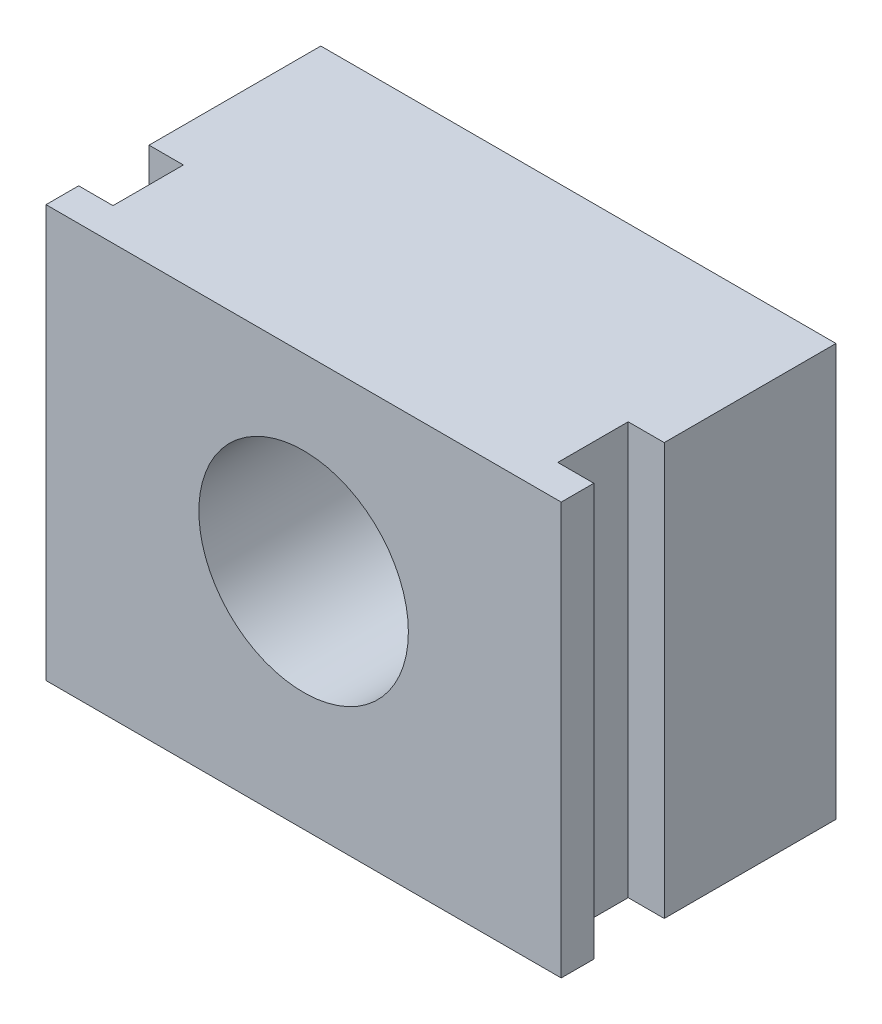
ISO-10303-21;
HEADER;
FILE_DESCRIPTION(('STEP AP214'),'2;1');
FILE_NAME('part.step','',(''),(''),'','','');
FILE_SCHEMA(('AUTOMOTIVE_DESIGN { 1 0 10303 214 1 1 1 1 }'));
ENDSEC;
DATA;
#1=APPLICATION_CONTEXT('core data for automotive mechanical design processes');
#2=APPLICATION_PROTOCOL_DEFINITION('international standard','automotive_design',2000,#1);
#3=PRODUCT_CONTEXT('',#1,'mechanical');
#4=PRODUCT('Part','Part','',(#3));
#5=PRODUCT_RELATED_PRODUCT_CATEGORY('part','',(#4));
#6=PRODUCT_DEFINITION_FORMATION('','',#4);
#7=PRODUCT_DEFINITION_CONTEXT('part definition',#1,'design');
#8=PRODUCT_DEFINITION('design','',#6,#7);
#9=PRODUCT_DEFINITION_SHAPE('','',#8);
#10=(LENGTH_UNIT() NAMED_UNIT(*) SI_UNIT(.MILLI.,.METRE.));
#11=(NAMED_UNIT(*) PLANE_ANGLE_UNIT() SI_UNIT($,.RADIAN.));
#12=(NAMED_UNIT(*) SI_UNIT($,.STERADIAN.) SOLID_ANGLE_UNIT());
#13=UNCERTAINTY_MEASURE_WITH_UNIT(LENGTH_MEASURE(1.E-05),#10,'distance_accuracy_value','');
#14=(GEOMETRIC_REPRESENTATION_CONTEXT(3) GLOBAL_UNCERTAINTY_ASSIGNED_CONTEXT((#13)) GLOBAL_UNIT_ASSIGNED_CONTEXT((#10,
#11,#12)) REPRESENTATION_CONTEXT('',''));
#15=CARTESIAN_POINT('',(0.,0.,0.));
#16=DIRECTION('',(0.,0.,1.));
#17=DIRECTION('',(1.,0.,0.));
#18=AXIS2_PLACEMENT_3D('',#15,#16,#17);
#19=CARTESIAN_POINT('',(0.,0.,5.));
#20=DIRECTION('',(0.,0.,1.));
#21=DIRECTION('',(1.,0.,0.));
#22=AXIS2_PLACEMENT_3D('',#19,#20,#21);
#23=PLANE('',#22);
#24=DIRECTION('',(-1.,0.,0.));
#25=VECTOR('',#24,1.);
#26=CARTESIAN_POINT('',(-7.5,6.,5.));
#27=LINE('',#26,#25);
#28=CARTESIAN_POINT('',(7.5,6.,5.));
#29=VERTEX_POINT('',#28);
#30=CARTESIAN_POINT('',(6.45,6.,5.));
#31=VERTEX_POINT('',#30);
#32=EDGE_CURVE('E233',#29,#31,#27,.T.);
#33=ORIENTED_EDGE('',*,*,#32,.T.);
#34=DIRECTION('',(0.,-1.,0.));
#35=VECTOR('',#34,1.);
#36=CARTESIAN_POINT('',(6.45,6.,5.));
#37=LINE('',#36,#35);
#38=CARTESIAN_POINT('',(6.45,-6.,5.));
#39=VERTEX_POINT('',#38);
#40=EDGE_CURVE('E164',#31,#39,#37,.T.);
#41=ORIENTED_EDGE('',*,*,#40,.T.);
#42=DIRECTION('',(1.,0.,0.));
#43=VECTOR('',#42,1.);
#44=CARTESIAN_POINT('',(-7.5,-6.,5.));
#45=LINE('',#44,#43);
#46=CARTESIAN_POINT('',(7.50000000000001,-6.,5.));
#47=VERTEX_POINT('',#46);
#48=EDGE_CURVE('E227',#39,#47,#45,.T.);
#49=ORIENTED_EDGE('',*,*,#48,.T.);
#50=DIRECTION('',(0.,1.,0.));
#51=VECTOR('',#50,1.);
#52=CARTESIAN_POINT('',(7.5,6.,5.));
#53=LINE('',#52,#51);
#54=EDGE_CURVE('E230',#47,#29,#53,.T.);
#55=ORIENTED_EDGE('',*,*,#54,.T.);
#56=EDGE_LOOP('',(#33,#41,#49,#55));
#57=FACE_BOUND('',#56,.T.);
#58=ADVANCED_FACE('F39',(#57),#23,.T.);
#59=CARTESIAN_POINT('',(-7.5,6.,5.));
#60=DIRECTION('',(1.,0.,0.));
#61=DIRECTION('',(0.,1.,0.));
#62=AXIS2_PLACEMENT_3D('',#59,#60,#61);
#63=PLANE('',#62);
#64=DIRECTION('',(0.,-1.,0.));
#65=VECTOR('',#64,1.);
#66=CARTESIAN_POINT('',(-7.5,6.,0.));
#67=LINE('',#66,#65);
#68=CARTESIAN_POINT('',(-7.5,6.,0.));
#69=VERTEX_POINT('',#68);
#70=CARTESIAN_POINT('',(-7.5,-6.,0.));
#71=VERTEX_POINT('',#70);
#72=EDGE_CURVE('E223',#69,#71,#67,.T.);
#73=ORIENTED_EDGE('',*,*,#72,.T.);
#74=DIRECTION('',(0.,0.,-1.));
#75=VECTOR('',#74,1.);
#76=CARTESIAN_POINT('',(-7.5,-6.,5.));
#77=LINE('',#76,#75);
#78=CARTESIAN_POINT('',(-7.5,-6.,5.));
#79=VERTEX_POINT('',#78);
#80=EDGE_CURVE('E11',#79,#71,#77,.T.);
#81=ORIENTED_EDGE('',*,*,#80,.F.);
#82=DIRECTION('',(0.,-1.,0.));
#83=VECTOR('',#82,1.);
#84=CARTESIAN_POINT('',(-7.5,6.,5.));
#85=LINE('',#84,#83);
#86=CARTESIAN_POINT('',(-7.5,6.,5.));
#87=VERTEX_POINT('',#86);
#88=EDGE_CURVE('E224',#87,#79,#85,.T.);
#89=ORIENTED_EDGE('',*,*,#88,.F.);
#90=DIRECTION('',(0.,0.,-1.));
#91=VECTOR('',#90,1.);
#92=CARTESIAN_POINT('',(-7.5,6.,5.));
#93=LINE('',#92,#91);
#94=EDGE_CURVE('E237',#87,#69,#93,.T.);
#95=ORIENTED_EDGE('',*,*,#94,.T.);
#96=EDGE_LOOP('',(#73,#81,#89,#95));
#97=FACE_BOUND('',#96,.T.);
#98=ADVANCED_FACE('F41',(#97),#63,.F.);
#99=CARTESIAN_POINT('',(-7.5,-6.,5.));
#100=DIRECTION('',(0.,1.,0.));
#101=DIRECTION('',(-1.,0.,0.));
#102=AXIS2_PLACEMENT_3D('',#99,#100,#101);
#103=PLANE('',#102);
#104=DIRECTION('',(1.,0.,0.));
#105=VECTOR('',#104,1.);
#106=CARTESIAN_POINT('',(-7.5,-6.,0.));
#107=LINE('',#106,#105);
#108=CARTESIAN_POINT('',(7.50000000000001,-6.,0.));
#109=VERTEX_POINT('',#108);
#110=EDGE_CURVE('E241',#71,#109,#107,.T.);
#111=ORIENTED_EDGE('',*,*,#110,.T.);
#112=DIRECTION('',(0.,0.,-1.));
#113=VECTOR('',#112,1.);
#114=CARTESIAN_POINT('',(7.50000000000001,-6.,5.));
#115=LINE('',#114,#113);
#116=EDGE_CURVE('E48',#47,#109,#115,.T.);
#117=ORIENTED_EDGE('',*,*,#116,.F.);
#118=ORIENTED_EDGE('',*,*,#48,.F.);
#119=DIRECTION('',(0.,0.,-1.));
#120=VECTOR('',#119,1.);
#121=CARTESIAN_POINT('',(6.45,-6.,7.05));
#122=LINE('',#121,#120);
#123=CARTESIAN_POINT('',(6.45,-6.,7.05));
#124=VERTEX_POINT('',#123);
#125=EDGE_CURVE('E55',#124,#39,#122,.T.);
#126=ORIENTED_EDGE('',*,*,#125,.F.);
#127=DIRECTION('',(1.,0.,0.));
#128=VECTOR('',#127,1.);
#129=CARTESIAN_POINT('',(-7.5,-6.,7.05));
#130=LINE('',#129,#128);
#131=CARTESIAN_POINT('',(7.50000000000001,-6.,7.05));
#132=VERTEX_POINT('',#131);
#133=EDGE_CURVE('E159',#124,#132,#130,.T.);
#134=ORIENTED_EDGE('',*,*,#133,.T.);
#135=DIRECTION('',(0.,0.,-1.));
#136=VECTOR('',#135,1.);
#137=CARTESIAN_POINT('',(7.50000000000001,-6.,8.));
#138=LINE('',#137,#136);
#139=CARTESIAN_POINT('',(7.50000000000001,-6.,8.));
#140=VERTEX_POINT('',#139);
#141=EDGE_CURVE('E156',#140,#132,#138,.T.);
#142=ORIENTED_EDGE('',*,*,#141,.F.);
#143=DIRECTION('',(1.,0.,0.));
#144=VECTOR('',#143,1.);
#145=CARTESIAN_POINT('',(-7.5,-6.,8.));
#146=LINE('',#145,#144);
#147=CARTESIAN_POINT('',(-7.5,-6.,8.));
#148=VERTEX_POINT('',#147);
#149=EDGE_CURVE('E141',#148,#140,#146,.T.);
#150=ORIENTED_EDGE('',*,*,#149,.F.);
#151=DIRECTION('',(0.,0.,-1.));
#152=VECTOR('',#151,1.);
#153=CARTESIAN_POINT('',(-7.5,-6.,8.));
#154=LINE('',#153,#152);
#155=CARTESIAN_POINT('',(-7.5,-6.,7.05));
#156=VERTEX_POINT('',#155);
#157=EDGE_CURVE('E178',#148,#156,#154,.T.);
#158=ORIENTED_EDGE('',*,*,#157,.T.);
#159=CARTESIAN_POINT('',(-6.5,-6.,7.05));
#160=VERTEX_POINT('',#159);
#161=EDGE_CURVE('E179',#156,#160,#130,.T.);
#162=ORIENTED_EDGE('',*,*,#161,.T.);
#163=DIRECTION('',(0.,0.,-1.));
#164=VECTOR('',#163,1.);
#165=CARTESIAN_POINT('',(-6.5,-6.,7.05));
#166=LINE('',#165,#164);
#167=CARTESIAN_POINT('',(-6.5,-6.,5.));
#168=VERTEX_POINT('',#167);
#169=EDGE_CURVE('E208',#160,#168,#166,.T.);
#170=ORIENTED_EDGE('',*,*,#169,.T.);
#171=EDGE_CURVE('E93',#79,#168,#45,.T.);
#172=ORIENTED_EDGE('',*,*,#171,.F.);
#173=ORIENTED_EDGE('',*,*,#80,.T.);
#174=EDGE_LOOP('',(#111,#117,#118,#126,#134,#142,#150,#158,#162,#170,#172,#173));
#175=FACE_BOUND('',#174,.T.);
#176=ADVANCED_FACE('F157',(#175),#103,.F.);
#177=CARTESIAN_POINT('',(7.5,6.,5.));
#178=DIRECTION('',(-1.,0.,0.));
#179=DIRECTION('',(0.,-1.,0.));
#180=AXIS2_PLACEMENT_3D('',#177,#178,#179);
#181=PLANE('',#180);
#182=DIRECTION('',(0.,1.,0.));
#183=VECTOR('',#182,1.);
#184=CARTESIAN_POINT('',(7.5,6.,0.));
#185=LINE('',#184,#183);
#186=CARTESIAN_POINT('',(7.5,6.,0.));
#187=VERTEX_POINT('',#186);
#188=EDGE_CURVE('E244',#109,#187,#185,.T.);
#189=ORIENTED_EDGE('',*,*,#188,.T.);
#190=DIRECTION('',(0.,0.,-1.));
#191=VECTOR('',#190,1.);
#192=CARTESIAN_POINT('',(7.5,6.,5.));
#193=LINE('',#192,#191);
#194=EDGE_CURVE('E251',#29,#187,#193,.T.);
#195=ORIENTED_EDGE('',*,*,#194,.F.);
#196=ORIENTED_EDGE('',*,*,#54,.F.);
#197=ORIENTED_EDGE('',*,*,#116,.T.);
#198=EDGE_LOOP('',(#189,#195,#196,#197));
#199=FACE_BOUND('',#198,.T.);
#200=ADVANCED_FACE('F259',(#199),#181,.F.);
#201=CARTESIAN_POINT('',(-7.5,6.,5.));
#202=DIRECTION('',(0.,-1.,0.));
#203=DIRECTION('',(0.,0.,-1.));
#204=AXIS2_PLACEMENT_3D('',#201,#202,#203);
#205=PLANE('',#204);
#206=DIRECTION('',(-1.,0.,0.));
#207=VECTOR('',#206,1.);
#208=CARTESIAN_POINT('',(-7.5,6.,0.));
#209=LINE('',#208,#207);
#210=EDGE_CURVE('E86',#187,#69,#209,.T.);
#211=ORIENTED_EDGE('',*,*,#210,.T.);
#212=ORIENTED_EDGE('',*,*,#94,.F.);
#213=CARTESIAN_POINT('',(-6.5,6.,5.));
#214=VERTEX_POINT('',#213);
#215=EDGE_CURVE('E64',#214,#87,#27,.T.);
#216=ORIENTED_EDGE('',*,*,#215,.F.);
#217=DIRECTION('',(0.,0.,-1.));
#218=VECTOR('',#217,1.);
#219=CARTESIAN_POINT('',(-6.5,6.,7.05));
#220=LINE('',#219,#218);
#221=CARTESIAN_POINT('',(-6.5,6.,7.05));
#222=VERTEX_POINT('',#221);
#223=EDGE_CURVE('E215',#222,#214,#220,.T.);
#224=ORIENTED_EDGE('',*,*,#223,.F.);
#225=DIRECTION('',(1.,0.,0.));
#226=VECTOR('',#225,1.);
#227=CARTESIAN_POINT('',(-7.5,6.,7.05));
#228=LINE('',#227,#226);
#229=CARTESIAN_POINT('',(-7.5,6.,7.05));
#230=VERTEX_POINT('',#229);
#231=EDGE_CURVE('E187',#230,#222,#228,.T.);
#232=ORIENTED_EDGE('',*,*,#231,.F.);
#233=DIRECTION('',(0.,0.,-1.));
#234=VECTOR('',#233,1.);
#235=CARTESIAN_POINT('',(-7.5,6.,8.));
#236=LINE('',#235,#234);
#237=CARTESIAN_POINT('',(-7.5,6.,8.));
#238=VERTEX_POINT('',#237);
#239=EDGE_CURVE('E195',#238,#230,#236,.T.);
#240=ORIENTED_EDGE('',*,*,#239,.F.);
#241=DIRECTION('',(1.,0.,0.));
#242=VECTOR('',#241,1.);
#243=CARTESIAN_POINT('',(-7.5,6.,8.));
#244=LINE('',#243,#242);
#245=CARTESIAN_POINT('',(7.50000000000001,6.,8.));
#246=VERTEX_POINT('',#245);
#247=EDGE_CURVE('E170',#238,#246,#244,.T.);
#248=ORIENTED_EDGE('',*,*,#247,.T.);
#249=DIRECTION('',(0.,0.,-1.));
#250=VECTOR('',#249,1.);
#251=CARTESIAN_POINT('',(7.50000000000001,6.,8.));
#252=LINE('',#251,#250);
#253=CARTESIAN_POINT('',(7.50000000000001,6.,7.05));
#254=VERTEX_POINT('',#253);
#255=EDGE_CURVE('E165',#246,#254,#252,.T.);
#256=ORIENTED_EDGE('',*,*,#255,.T.);
#257=CARTESIAN_POINT('',(6.45,6.,7.05));
#258=VERTEX_POINT('',#257);
#259=EDGE_CURVE('E186',#258,#254,#228,.T.);
#260=ORIENTED_EDGE('',*,*,#259,.F.);
#261=DIRECTION('',(0.,0.,-1.));
#262=VECTOR('',#261,1.);
#263=CARTESIAN_POINT('',(6.45,6.,7.05));
#264=LINE('',#263,#262);
#265=EDGE_CURVE('E218',#258,#31,#264,.T.);
#266=ORIENTED_EDGE('',*,*,#265,.T.);
#267=ORIENTED_EDGE('',*,*,#32,.F.);
#268=ORIENTED_EDGE('',*,*,#194,.T.);
#269=EDGE_LOOP('',(#211,#212,#216,#224,#232,#240,#248,#256,#260,#266,#267,#268));
#270=FACE_BOUND('',#269,.T.);
#271=ADVANCED_FACE('F268',(#270),#205,.F.);
#272=DIRECTION('',(0.,-1.,0.));
#273=VECTOR('',#272,1.);
#274=CARTESIAN_POINT('',(-6.5,6.,5.));
#275=LINE('',#274,#273);
#276=EDGE_CURVE('E204',#214,#168,#275,.T.);
#277=ORIENTED_EDGE('',*,*,#276,.F.);
#278=ORIENTED_EDGE('',*,*,#215,.T.);
#279=ORIENTED_EDGE('',*,*,#88,.T.);
#280=ORIENTED_EDGE('',*,*,#171,.T.);
#281=EDGE_LOOP('',(#277,#278,#279,#280));
#282=FACE_BOUND('',#281,.T.);
#283=ADVANCED_FACE('F308',(#282),#23,.T.);
#284=CARTESIAN_POINT('',(0.,0.,0.));
#285=DIRECTION('',(0.,0.,1.));
#286=DIRECTION('',(1.,0.,0.));
#287=AXIS2_PLACEMENT_3D('',#284,#285,#286);
#288=PLANE('',#287);
#289=CARTESIAN_POINT('',(0.,0.5,0.));
#290=DIRECTION('',(0.,0.,1.));
#291=DIRECTION('',(1.,0.,0.));
#292=AXIS2_PLACEMENT_3D('',#289,#290,#291);
#293=CIRCLE('',#292,3.05);
#294=CARTESIAN_POINT('',(3.05,0.5,0.));
#295=VERTEX_POINT('',#294);
#296=EDGE_CURVE('E280',#295,#295,#293,.T.);
#297=ORIENTED_EDGE('',*,*,#296,.T.);
#298=EDGE_LOOP('',(#297));
#299=FACE_BOUND('',#298,.T.);
#300=ORIENTED_EDGE('',*,*,#72,.F.);
#301=ORIENTED_EDGE('',*,*,#210,.F.);
#302=ORIENTED_EDGE('',*,*,#188,.F.);
#303=ORIENTED_EDGE('',*,*,#110,.F.);
#304=EDGE_LOOP('',(#300,#301,#302,#303));
#305=FACE_BOUND('',#304,.T.);
#306=ADVANCED_FACE('F264',(#299,#305),#288,.F.);
#307=CARTESIAN_POINT('',(6.45,6.,7.05));
#308=DIRECTION('',(1.,0.,0.));
#309=DIRECTION('',(0.,1.,0.));
#310=AXIS2_PLACEMENT_3D('',#307,#308,#309);
#311=PLANE('',#310);
#312=ORIENTED_EDGE('',*,*,#40,.F.);
#313=ORIENTED_EDGE('',*,*,#265,.F.);
#314=DIRECTION('',(0.,-1.,0.));
#315=VECTOR('',#314,1.);
#316=CARTESIAN_POINT('',(6.45,6.,7.05));
#317=LINE('',#316,#315);
#318=EDGE_CURVE('E200',#258,#124,#317,.T.);
#319=ORIENTED_EDGE('',*,*,#318,.T.);
#320=ORIENTED_EDGE('',*,*,#125,.T.);
#321=EDGE_LOOP('',(#312,#313,#319,#320));
#322=FACE_BOUND('',#321,.T.);
#323=ADVANCED_FACE('F275',(#322),#311,.T.);
#324=CARTESIAN_POINT('',(-6.5,6.,7.05));
#325=DIRECTION('',(1.,0.,0.));
#326=DIRECTION('',(0.,1.,0.));
#327=AXIS2_PLACEMENT_3D('',#324,#325,#326);
#328=PLANE('',#327);
#329=ORIENTED_EDGE('',*,*,#276,.T.);
#330=ORIENTED_EDGE('',*,*,#169,.F.);
#331=DIRECTION('',(0.,-1.,0.));
#332=VECTOR('',#331,1.);
#333=CARTESIAN_POINT('',(-6.5,6.,7.05));
#334=LINE('',#333,#332);
#335=EDGE_CURVE('E203',#222,#160,#334,.T.);
#336=ORIENTED_EDGE('',*,*,#335,.F.);
#337=ORIENTED_EDGE('',*,*,#223,.T.);
#338=EDGE_LOOP('',(#329,#330,#336,#337));
#339=FACE_BOUND('',#338,.T.);
#340=ADVANCED_FACE('F321',(#339),#328,.F.);
#341=CARTESIAN_POINT('',(0.,0.,7.05));
#342=DIRECTION('',(0.,0.,-1.));
#343=DIRECTION('',(-1.,0.,0.));
#344=AXIS2_PLACEMENT_3D('',#341,#342,#343);
#345=PLANE('',#344);
#346=ORIENTED_EDGE('',*,*,#318,.F.);
#347=ORIENTED_EDGE('',*,*,#259,.T.);
#348=DIRECTION('',(0.,-1.,0.));
#349=VECTOR('',#348,1.);
#350=CARTESIAN_POINT('',(7.50000000000001,6.,7.05));
#351=LINE('',#350,#349);
#352=EDGE_CURVE('E183',#254,#132,#351,.T.);
#353=ORIENTED_EDGE('',*,*,#352,.T.);
#354=ORIENTED_EDGE('',*,*,#133,.F.);
#355=EDGE_LOOP('',(#346,#347,#353,#354));
#356=FACE_BOUND('',#355,.T.);
#357=ADVANCED_FACE('F278',(#356),#345,.T.);
#358=CARTESIAN_POINT('',(7.50000000000001,6.,8.));
#359=DIRECTION('',(1.,0.,0.));
#360=DIRECTION('',(0.,0.,-1.));
#361=AXIS2_PLACEMENT_3D('',#358,#359,#360);
#362=PLANE('',#361);
#363=ORIENTED_EDGE('',*,*,#352,.F.);
#364=ORIENTED_EDGE('',*,*,#255,.F.);
#365=DIRECTION('',(0.,-1.,0.));
#366=VECTOR('',#365,1.);
#367=CARTESIAN_POINT('',(7.50000000000001,6.,8.));
#368=LINE('',#367,#366);
#369=EDGE_CURVE('E146',#246,#140,#368,.T.);
#370=ORIENTED_EDGE('',*,*,#369,.T.);
#371=ORIENTED_EDGE('',*,*,#141,.T.);
#372=EDGE_LOOP('',(#363,#364,#370,#371));
#373=FACE_BOUND('',#372,.T.);
#374=ADVANCED_FACE('F167',(#373),#362,.T.);
#375=CARTESIAN_POINT('',(-7.5,6.,8.));
#376=DIRECTION('',(1.,0.,0.));
#377=DIRECTION('',(0.,0.,-1.));
#378=AXIS2_PLACEMENT_3D('',#375,#376,#377);
#379=PLANE('',#378);
#380=DIRECTION('',(0.,-1.,0.));
#381=VECTOR('',#380,1.);
#382=CARTESIAN_POINT('',(-7.5,6.,7.05));
#383=LINE('',#382,#381);
#384=EDGE_CURVE('E153',#230,#156,#383,.T.);
#385=ORIENTED_EDGE('',*,*,#384,.T.);
#386=ORIENTED_EDGE('',*,*,#157,.F.);
#387=DIRECTION('',(0.,-1.,0.));
#388=VECTOR('',#387,1.);
#389=CARTESIAN_POINT('',(-7.5,6.,8.));
#390=LINE('',#389,#388);
#391=EDGE_CURVE('E149',#238,#148,#390,.T.);
#392=ORIENTED_EDGE('',*,*,#391,.F.);
#393=ORIENTED_EDGE('',*,*,#239,.T.);
#394=EDGE_LOOP('',(#385,#386,#392,#393));
#395=FACE_BOUND('',#394,.T.);
#396=ADVANCED_FACE('F295',(#395),#379,.F.);
#397=CARTESIAN_POINT('',(0.,0.,8.));
#398=DIRECTION('',(0.,0.,-1.));
#399=DIRECTION('',(-1.,0.,0.));
#400=AXIS2_PLACEMENT_3D('',#397,#398,#399);
#401=PLANE('',#400);
#402=CARTESIAN_POINT('',(0.,0.5,8.));
#403=DIRECTION('',(0.,0.,1.));
#404=DIRECTION('',(1.,0.,0.));
#405=AXIS2_PLACEMENT_3D('',#402,#403,#404);
#406=CIRCLE('',#405,3.05);
#407=CARTESIAN_POINT('',(3.05,0.5,8.));
#408=VERTEX_POINT('',#407);
#409=EDGE_CURVE('E283',#408,#408,#406,.T.);
#410=ORIENTED_EDGE('',*,*,#409,.F.);
#411=EDGE_LOOP('',(#410));
#412=FACE_BOUND('',#411,.T.);
#413=ORIENTED_EDGE('',*,*,#149,.T.);
#414=ORIENTED_EDGE('',*,*,#369,.F.);
#415=ORIENTED_EDGE('',*,*,#247,.F.);
#416=ORIENTED_EDGE('',*,*,#391,.T.);
#417=EDGE_LOOP('',(#413,#414,#415,#416));
#418=FACE_BOUND('',#417,.T.);
#419=ADVANCED_FACE('F143',(#412,#418),#401,.F.);
#420=ORIENTED_EDGE('',*,*,#231,.T.);
#421=ORIENTED_EDGE('',*,*,#335,.T.);
#422=ORIENTED_EDGE('',*,*,#161,.F.);
#423=ORIENTED_EDGE('',*,*,#384,.F.);
#424=EDGE_LOOP('',(#420,#421,#422,#423));
#425=FACE_BOUND('',#424,.T.);
#426=ADVANCED_FACE('F294',(#425),#345,.T.);
#427=CARTESIAN_POINT('',(0.,0.5,0.));
#428=DIRECTION('',(0.,0.,1.));
#429=DIRECTION('',(1.,0.,0.));
#430=AXIS2_PLACEMENT_3D('',#427,#428,#429);
#431=CYLINDRICAL_SURFACE('',#430,3.05);
#432=ORIENTED_EDGE('',*,*,#296,.F.);
#433=EDGE_LOOP('',(#432));
#434=FACE_BOUND('',#433,.T.);
#435=ORIENTED_EDGE('',*,*,#409,.T.);
#436=EDGE_LOOP('',(#435));
#437=FACE_BOUND('',#436,.T.);
#438=ADVANCED_FACE('F291',(#434,#437),#431,.F.);
#439=CLOSED_SHELL('',(#58,#98,#176,#200,#271,#283,#306,#323,#340,#357,#374,#396,#419,#426,#438));
#440=MANIFOLD_SOLID_BREP('B2',#439);
#441=ADVANCED_BREP_SHAPE_REPRESENTATION('',(#18,#440),#14);
#442=SHAPE_DEFINITION_REPRESENTATION(#9,#441);
ENDSEC;
END-ISO-10303-21;
